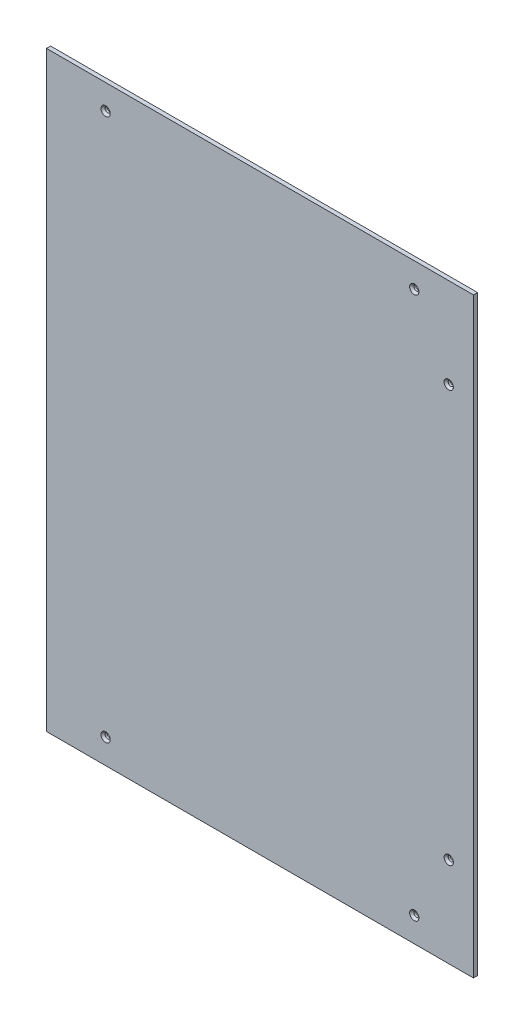
ISO-10303-21;
HEADER;
FILE_DESCRIPTION(('STEP AP214'),'2;1');
FILE_NAME('part.step','',(''),(''),'','','');
FILE_SCHEMA(('AUTOMOTIVE_DESIGN { 1 0 10303 214 1 1 1 1 }'));
ENDSEC;
DATA;
#1=APPLICATION_CONTEXT('core data for automotive mechanical design processes');
#2=APPLICATION_PROTOCOL_DEFINITION('international standard','automotive_design',2000,#1);
#3=PRODUCT_CONTEXT('',#1,'mechanical');
#4=PRODUCT('Part','Part','',(#3));
#5=PRODUCT_RELATED_PRODUCT_CATEGORY('part','',(#4));
#6=PRODUCT_DEFINITION_FORMATION('','',#4);
#7=PRODUCT_DEFINITION_CONTEXT('part definition',#1,'design');
#8=PRODUCT_DEFINITION('design','',#6,#7);
#9=PRODUCT_DEFINITION_SHAPE('','',#8);
#10=(LENGTH_UNIT() NAMED_UNIT(*) SI_UNIT(.MILLI.,.METRE.));
#11=(NAMED_UNIT(*) PLANE_ANGLE_UNIT() SI_UNIT($,.RADIAN.));
#12=(NAMED_UNIT(*) SI_UNIT($,.STERADIAN.) SOLID_ANGLE_UNIT());
#13=UNCERTAINTY_MEASURE_WITH_UNIT(LENGTH_MEASURE(1.E-05),#10,'distance_accuracy_value','');
#14=(GEOMETRIC_REPRESENTATION_CONTEXT(3) GLOBAL_UNCERTAINTY_ASSIGNED_CONTEXT((#13)) GLOBAL_UNIT_ASSIGNED_CONTEXT((#10,
#11,#12)) REPRESENTATION_CONTEXT('',''));
#15=CARTESIAN_POINT('',(0.,0.,0.));
#16=DIRECTION('',(0.,0.,1.));
#17=DIRECTION('',(1.,0.,0.));
#18=AXIS2_PLACEMENT_3D('',#15,#16,#17);
#19=CARTESIAN_POINT('',(207.5,-287.5,2.));
#20=DIRECTION('',(-1.,0.,0.));
#21=DIRECTION('',(0.,0.,1.));
#22=AXIS2_PLACEMENT_3D('',#19,#20,#21);
#23=PLANE('',#22);
#24=DIRECTION('',(0.,1.,0.));
#25=VECTOR('',#24,1.);
#26=CARTESIAN_POINT('',(207.5,-287.5,-2.));
#27=LINE('',#26,#25);
#28=CARTESIAN_POINT('',(207.5,-287.5,-2.));
#29=VERTEX_POINT('',#28);
#30=CARTESIAN_POINT('',(207.5,287.5,-2.));
#31=VERTEX_POINT('',#30);
#32=EDGE_CURVE('E126',#29,#31,#27,.T.);
#33=ORIENTED_EDGE('',*,*,#32,.T.);
#34=DIRECTION('',(0.,0.,-1.));
#35=VECTOR('',#34,1.);
#36=CARTESIAN_POINT('',(207.5,287.5,2.));
#37=LINE('',#36,#35);
#38=CARTESIAN_POINT('',(207.5,287.5,2.));
#39=VERTEX_POINT('',#38);
#40=EDGE_CURVE('E114',#39,#31,#37,.T.);
#41=ORIENTED_EDGE('',*,*,#40,.F.);
#42=DIRECTION('',(0.,1.,0.));
#43=VECTOR('',#42,1.);
#44=CARTESIAN_POINT('',(207.5,-287.5,2.));
#45=LINE('',#44,#43);
#46=CARTESIAN_POINT('',(207.5,-287.5,2.));
#47=VERTEX_POINT('',#46);
#48=EDGE_CURVE('E106',#47,#39,#45,.T.);
#49=ORIENTED_EDGE('',*,*,#48,.F.);
#50=DIRECTION('',(0.,0.,-1.));
#51=VECTOR('',#50,1.);
#52=CARTESIAN_POINT('',(207.5,-287.5,2.));
#53=LINE('',#52,#51);
#54=EDGE_CURVE('E122',#47,#29,#53,.T.);
#55=ORIENTED_EDGE('',*,*,#54,.T.);
#56=EDGE_LOOP('',(#33,#41,#49,#55));
#57=FACE_BOUND('',#56,.T.);
#58=ADVANCED_FACE('F51',(#57),#23,.F.);
#59=CARTESIAN_POINT('',(-207.5,287.5,2.));
#60=DIRECTION('',(0.,-1.,0.));
#61=DIRECTION('',(0.,0.,-1.));
#62=AXIS2_PLACEMENT_3D('',#59,#60,#61);
#63=PLANE('',#62);
#64=DIRECTION('',(-1.,0.,0.));
#65=VECTOR('',#64,1.);
#66=CARTESIAN_POINT('',(-207.5,287.5,-2.));
#67=LINE('',#66,#65);
#68=CARTESIAN_POINT('',(-207.5,287.5,-2.));
#69=VERTEX_POINT('',#68);
#70=EDGE_CURVE('E112',#31,#69,#67,.T.);
#71=ORIENTED_EDGE('',*,*,#70,.T.);
#72=DIRECTION('',(0.,0.,-1.));
#73=VECTOR('',#72,1.);
#74=CARTESIAN_POINT('',(-207.5,287.5,2.));
#75=LINE('',#74,#73);
#76=CARTESIAN_POINT('',(-207.5,287.5,2.));
#77=VERTEX_POINT('',#76);
#78=EDGE_CURVE('E110',#77,#69,#75,.T.);
#79=ORIENTED_EDGE('',*,*,#78,.F.);
#80=DIRECTION('',(-1.,0.,0.));
#81=VECTOR('',#80,1.);
#82=CARTESIAN_POINT('',(-207.5,287.5,2.));
#83=LINE('',#82,#81);
#84=EDGE_CURVE('E101',#39,#77,#83,.T.);
#85=ORIENTED_EDGE('',*,*,#84,.F.);
#86=ORIENTED_EDGE('',*,*,#40,.T.);
#87=EDGE_LOOP('',(#71,#79,#85,#86));
#88=FACE_BOUND('',#87,.T.);
#89=ADVANCED_FACE('F111',(#88),#63,.F.);
#90=CARTESIAN_POINT('',(-207.5,-287.5,2.));
#91=DIRECTION('',(1.,0.,0.));
#92=DIRECTION('',(0.,0.,-1.));
#93=AXIS2_PLACEMENT_3D('',#90,#91,#92);
#94=PLANE('',#93);
#95=DIRECTION('',(0.,-1.,0.));
#96=VECTOR('',#95,1.);
#97=CARTESIAN_POINT('',(-207.5,-287.5,-2.));
#98=LINE('',#97,#96);
#99=CARTESIAN_POINT('',(-207.5,-287.5,-2.));
#100=VERTEX_POINT('',#99);
#101=EDGE_CURVE('E87',#69,#100,#98,.T.);
#102=ORIENTED_EDGE('',*,*,#101,.T.);
#103=DIRECTION('',(0.,0.,-1.));
#104=VECTOR('',#103,1.);
#105=CARTESIAN_POINT('',(-207.5,-287.5,2.));
#106=LINE('',#105,#104);
#107=CARTESIAN_POINT('',(-207.5,-287.5,2.));
#108=VERTEX_POINT('',#107);
#109=EDGE_CURVE('E115',#108,#100,#106,.T.);
#110=ORIENTED_EDGE('',*,*,#109,.F.);
#111=DIRECTION('',(0.,-1.,0.));
#112=VECTOR('',#111,1.);
#113=CARTESIAN_POINT('',(-207.5,-287.5,2.));
#114=LINE('',#113,#112);
#115=EDGE_CURVE('E104',#77,#108,#114,.T.);
#116=ORIENTED_EDGE('',*,*,#115,.F.);
#117=ORIENTED_EDGE('',*,*,#78,.T.);
#118=EDGE_LOOP('',(#102,#110,#116,#117));
#119=FACE_BOUND('',#118,.T.);
#120=ADVANCED_FACE('F117',(#119),#94,.F.);
#121=CARTESIAN_POINT('',(-207.5,-287.5,2.));
#122=DIRECTION('',(0.,1.,0.));
#123=DIRECTION('',(0.,0.,1.));
#124=AXIS2_PLACEMENT_3D('',#121,#122,#123);
#125=PLANE('',#124);
#126=DIRECTION('',(1.,0.,0.));
#127=VECTOR('',#126,1.);
#128=CARTESIAN_POINT('',(-207.5,-287.5,-2.));
#129=LINE('',#128,#127);
#130=EDGE_CURVE('E93',#100,#29,#129,.T.);
#131=ORIENTED_EDGE('',*,*,#130,.T.);
#132=ORIENTED_EDGE('',*,*,#54,.F.);
#133=DIRECTION('',(1.,0.,0.));
#134=VECTOR('',#133,1.);
#135=CARTESIAN_POINT('',(-207.5,-287.5,2.));
#136=LINE('',#135,#134);
#137=EDGE_CURVE('E70',#108,#47,#136,.T.);
#138=ORIENTED_EDGE('',*,*,#137,.F.);
#139=ORIENTED_EDGE('',*,*,#109,.T.);
#140=EDGE_LOOP('',(#131,#132,#138,#139));
#141=FACE_BOUND('',#140,.T.);
#142=ADVANCED_FACE('F320',(#141),#125,.F.);
#143=CARTESIAN_POINT('',(0.,0.,2.));
#144=DIRECTION('',(0.,0.,-1.));
#145=DIRECTION('',(-1.,0.,0.));
#146=AXIS2_PLACEMENT_3D('',#143,#144,#145);
#147=PLANE('',#146);
#148=CARTESIAN_POINT('',(150.,263.5,2.));
#149=DIRECTION('',(0.,0.,-1.));
#150=DIRECTION('',(-1.,0.,0.));
#151=AXIS2_PLACEMENT_3D('',#148,#149,#150);
#152=CIRCLE('',#151,4.49999999999995);
#153=CARTESIAN_POINT('',(145.5,263.5,2.));
#154=VERTEX_POINT('',#153);
#155=EDGE_CURVE('E167',#154,#154,#152,.T.);
#156=ORIENTED_EDGE('',*,*,#155,.T.);
#157=EDGE_LOOP('',(#156));
#158=FACE_BOUND('',#157,.T.);
#159=CARTESIAN_POINT('',(-150.,263.5,2.));
#160=DIRECTION('',(0.,0.,-1.));
#161=DIRECTION('',(-1.,0.,0.));
#162=AXIS2_PLACEMENT_3D('',#159,#160,#161);
#163=CIRCLE('',#162,4.49999999999995);
#164=CARTESIAN_POINT('',(-154.5,263.5,2.));
#165=VERTEX_POINT('',#164);
#166=EDGE_CURVE('E163',#165,#165,#163,.T.);
#167=ORIENTED_EDGE('',*,*,#166,.T.);
#168=EDGE_LOOP('',(#167));
#169=FACE_BOUND('',#168,.T.);
#170=CARTESIAN_POINT('',(183.5,200.,2.));
#171=DIRECTION('',(0.,0.,-1.));
#172=DIRECTION('',(-1.,0.,0.));
#173=AXIS2_PLACEMENT_3D('',#170,#171,#172);
#174=CIRCLE('',#173,4.49999999999995);
#175=CARTESIAN_POINT('',(179.,200.,2.));
#176=VERTEX_POINT('',#175);
#177=EDGE_CURVE('E159',#176,#176,#174,.T.);
#178=ORIENTED_EDGE('',*,*,#177,.T.);
#179=EDGE_LOOP('',(#178));
#180=FACE_BOUND('',#179,.T.);
#181=CARTESIAN_POINT('',(183.5,-200.,2.));
#182=DIRECTION('',(0.,0.,-1.));
#183=DIRECTION('',(-1.,0.,0.));
#184=AXIS2_PLACEMENT_3D('',#181,#182,#183);
#185=CIRCLE('',#184,4.49999999999995);
#186=CARTESIAN_POINT('',(179.,-200.,2.));
#187=VERTEX_POINT('',#186);
#188=EDGE_CURVE('E155',#187,#187,#185,.T.);
#189=ORIENTED_EDGE('',*,*,#188,.T.);
#190=EDGE_LOOP('',(#189));
#191=FACE_BOUND('',#190,.T.);
#192=CARTESIAN_POINT('',(150.,-263.5,2.));
#193=DIRECTION('',(0.,0.,-1.));
#194=DIRECTION('',(-1.,0.,0.));
#195=AXIS2_PLACEMENT_3D('',#192,#193,#194);
#196=CIRCLE('',#195,4.49999999999995);
#197=CARTESIAN_POINT('',(145.5,-263.5,2.));
#198=VERTEX_POINT('',#197);
#199=EDGE_CURVE('E151',#198,#198,#196,.T.);
#200=ORIENTED_EDGE('',*,*,#199,.T.);
#201=EDGE_LOOP('',(#200));
#202=FACE_BOUND('',#201,.T.);
#203=CARTESIAN_POINT('',(-150.,-263.5,2.));
#204=DIRECTION('',(0.,0.,-1.));
#205=DIRECTION('',(-1.,0.,0.));
#206=AXIS2_PLACEMENT_3D('',#203,#204,#205);
#207=CIRCLE('',#206,4.49999999999995);
#208=CARTESIAN_POINT('',(-154.5,-263.5,2.));
#209=VERTEX_POINT('',#208);
#210=EDGE_CURVE('E147',#209,#209,#207,.T.);
#211=ORIENTED_EDGE('',*,*,#210,.T.);
#212=EDGE_LOOP('',(#211));
#213=FACE_BOUND('',#212,.T.);
#214=ORIENTED_EDGE('',*,*,#48,.T.);
#215=ORIENTED_EDGE('',*,*,#84,.T.);
#216=ORIENTED_EDGE('',*,*,#115,.T.);
#217=ORIENTED_EDGE('',*,*,#137,.T.);
#218=EDGE_LOOP('',(#214,#215,#216,#217));
#219=FACE_BOUND('',#218,.T.);
#220=ADVANCED_FACE('F102',(#158,#169,#180,#191,#202,#213,#219),#147,.F.);
#221=CARTESIAN_POINT('',(0.,0.,-2.));
#222=DIRECTION('',(0.,0.,-1.));
#223=DIRECTION('',(-1.,0.,0.));
#224=AXIS2_PLACEMENT_3D('',#221,#222,#223);
#225=PLANE('',#224);
#226=CARTESIAN_POINT('',(150.,-263.5,-2.));
#227=DIRECTION('',(0.,0.,1.));
#228=DIRECTION('',(1.,0.,0.));
#229=AXIS2_PLACEMENT_3D('',#226,#227,#228);
#230=CIRCLE('',#229,2.5);
#231=CARTESIAN_POINT('',(152.5,-263.5,-2.));
#232=VERTEX_POINT('',#231);
#233=EDGE_CURVE('E266',#232,#232,#230,.T.);
#234=ORIENTED_EDGE('',*,*,#233,.T.);
#235=EDGE_LOOP('',(#234));
#236=FACE_BOUND('',#235,.T.);
#237=CARTESIAN_POINT('',(183.5,-200.,-2.));
#238=DIRECTION('',(0.,0.,1.));
#239=DIRECTION('',(1.,0.,0.));
#240=AXIS2_PLACEMENT_3D('',#237,#238,#239);
#241=CIRCLE('',#240,2.5);
#242=CARTESIAN_POINT('',(186.,-200.,-2.));
#243=VERTEX_POINT('',#242);
#244=EDGE_CURVE('E259',#243,#243,#241,.T.);
#245=ORIENTED_EDGE('',*,*,#244,.T.);
#246=EDGE_LOOP('',(#245));
#247=FACE_BOUND('',#246,.T.);
#248=CARTESIAN_POINT('',(183.5,200.,-2.));
#249=DIRECTION('',(0.,0.,1.));
#250=DIRECTION('',(1.,0.,0.));
#251=AXIS2_PLACEMENT_3D('',#248,#249,#250);
#252=CIRCLE('',#251,2.5);
#253=CARTESIAN_POINT('',(186.,200.,-2.));
#254=VERTEX_POINT('',#253);
#255=EDGE_CURVE('E256',#254,#254,#252,.T.);
#256=ORIENTED_EDGE('',*,*,#255,.T.);
#257=EDGE_LOOP('',(#256));
#258=FACE_BOUND('',#257,.T.);
#259=CARTESIAN_POINT('',(-150.,263.5,-2.));
#260=DIRECTION('',(0.,0.,1.));
#261=DIRECTION('',(1.,0.,0.));
#262=AXIS2_PLACEMENT_3D('',#259,#260,#261);
#263=CIRCLE('',#262,2.5);
#264=CARTESIAN_POINT('',(-147.5,263.5,-2.));
#265=VERTEX_POINT('',#264);
#266=EDGE_CURVE('E260',#265,#265,#263,.T.);
#267=ORIENTED_EDGE('',*,*,#266,.T.);
#268=EDGE_LOOP('',(#267));
#269=FACE_BOUND('',#268,.T.);
#270=CARTESIAN_POINT('',(150.,263.5,-2.));
#271=DIRECTION('',(0.,0.,1.));
#272=DIRECTION('',(1.,0.,0.));
#273=AXIS2_PLACEMENT_3D('',#270,#271,#272);
#274=CIRCLE('',#273,2.5);
#275=CARTESIAN_POINT('',(152.5,263.5,-2.));
#276=VERTEX_POINT('',#275);
#277=EDGE_CURVE('E269',#276,#276,#274,.T.);
#278=ORIENTED_EDGE('',*,*,#277,.T.);
#279=EDGE_LOOP('',(#278));
#280=FACE_BOUND('',#279,.T.);
#281=CARTESIAN_POINT('',(-150.,-263.5,-2.));
#282=DIRECTION('',(0.,0.,1.));
#283=DIRECTION('',(1.,0.,0.));
#284=AXIS2_PLACEMENT_3D('',#281,#282,#283);
#285=CIRCLE('',#284,2.5);
#286=CARTESIAN_POINT('',(-147.5,-263.5,-2.));
#287=VERTEX_POINT('',#286);
#288=EDGE_CURVE('E130',#287,#287,#285,.T.);
#289=ORIENTED_EDGE('',*,*,#288,.T.);
#290=EDGE_LOOP('',(#289));
#291=FACE_BOUND('',#290,.T.);
#292=ORIENTED_EDGE('',*,*,#32,.F.);
#293=ORIENTED_EDGE('',*,*,#130,.F.);
#294=ORIENTED_EDGE('',*,*,#101,.F.);
#295=ORIENTED_EDGE('',*,*,#70,.F.);
#296=EDGE_LOOP('',(#292,#293,#294,#295));
#297=FACE_BOUND('',#296,.T.);
#298=ADVANCED_FACE('F295',(#236,#247,#258,#269,#280,#291,#297),#225,.T.);
#299=CARTESIAN_POINT('',(-150.,-263.5,-2.));
#300=DIRECTION('',(0.,0.,1.));
#301=DIRECTION('',(1.,0.,0.));
#302=AXIS2_PLACEMENT_3D('',#299,#300,#301);
#303=CYLINDRICAL_SURFACE('',#302,2.5);
#304=CARTESIAN_POINT('',(-150.,-263.5,0.));
#305=DIRECTION('',(0.,0.,-1.));
#306=DIRECTION('',(-1.,0.,0.));
#307=AXIS2_PLACEMENT_3D('',#304,#305,#306);
#308=CIRCLE('',#307,2.5);
#309=CARTESIAN_POINT('',(-152.5,-263.5,0.));
#310=VERTEX_POINT('',#309);
#311=EDGE_CURVE('E11',#310,#310,#308,.F.);
#312=ORIENTED_EDGE('',*,*,#311,.T.);
#313=EDGE_LOOP('',(#312));
#314=FACE_BOUND('',#313,.T.);
#315=ORIENTED_EDGE('',*,*,#288,.F.);
#316=EDGE_LOOP('',(#315));
#317=FACE_BOUND('',#316,.T.);
#318=ADVANCED_FACE('F300',(#314,#317),#303,.F.);
#319=CARTESIAN_POINT('',(150.,263.5,-2.));
#320=DIRECTION('',(0.,0.,1.));
#321=DIRECTION('',(1.,0.,0.));
#322=AXIS2_PLACEMENT_3D('',#319,#320,#321);
#323=CYLINDRICAL_SURFACE('',#322,2.5);
#324=CARTESIAN_POINT('',(150.,263.5,0.));
#325=DIRECTION('',(0.,0.,-1.));
#326=DIRECTION('',(-1.,0.,0.));
#327=AXIS2_PLACEMENT_3D('',#324,#325,#326);
#328=CIRCLE('',#327,2.5);
#329=CARTESIAN_POINT('',(147.5,263.5,0.));
#330=VERTEX_POINT('',#329);
#331=EDGE_CURVE('E143',#330,#330,#328,.F.);
#332=ORIENTED_EDGE('',*,*,#331,.T.);
#333=EDGE_LOOP('',(#332));
#334=FACE_BOUND('',#333,.T.);
#335=ORIENTED_EDGE('',*,*,#277,.F.);
#336=EDGE_LOOP('',(#335));
#337=FACE_BOUND('',#336,.T.);
#338=ADVANCED_FACE('F298',(#334,#337),#323,.F.);
#339=CARTESIAN_POINT('',(-150.,263.5,-2.));
#340=DIRECTION('',(0.,0.,1.));
#341=DIRECTION('',(1.,0.,0.));
#342=AXIS2_PLACEMENT_3D('',#339,#340,#341);
#343=CYLINDRICAL_SURFACE('',#342,2.5);
#344=CARTESIAN_POINT('',(-150.,263.5,0.));
#345=DIRECTION('',(0.,0.,-1.));
#346=DIRECTION('',(-1.,0.,0.));
#347=AXIS2_PLACEMENT_3D('',#344,#345,#346);
#348=CIRCLE('',#347,2.5);
#349=CARTESIAN_POINT('',(-152.5,263.5,0.));
#350=VERTEX_POINT('',#349);
#351=EDGE_CURVE('E171',#350,#350,#348,.F.);
#352=ORIENTED_EDGE('',*,*,#351,.T.);
#353=EDGE_LOOP('',(#352));
#354=FACE_BOUND('',#353,.T.);
#355=ORIENTED_EDGE('',*,*,#266,.F.);
#356=EDGE_LOOP('',(#355));
#357=FACE_BOUND('',#356,.T.);
#358=ADVANCED_FACE('F252',(#354,#357),#343,.F.);
#359=CARTESIAN_POINT('',(183.5,200.,-2.));
#360=DIRECTION('',(0.,0.,1.));
#361=DIRECTION('',(1.,0.,0.));
#362=AXIS2_PLACEMENT_3D('',#359,#360,#361);
#363=CYLINDRICAL_SURFACE('',#362,2.5);
#364=CARTESIAN_POINT('',(183.5,200.,0.));
#365=DIRECTION('',(0.,0.,-1.));
#366=DIRECTION('',(-1.,0.,0.));
#367=AXIS2_PLACEMENT_3D('',#364,#365,#366);
#368=CIRCLE('',#367,2.5);
#369=CARTESIAN_POINT('',(181.,200.,0.));
#370=VERTEX_POINT('',#369);
#371=EDGE_CURVE('E175',#370,#370,#368,.F.);
#372=ORIENTED_EDGE('',*,*,#371,.T.);
#373=EDGE_LOOP('',(#372));
#374=FACE_BOUND('',#373,.T.);
#375=ORIENTED_EDGE('',*,*,#255,.F.);
#376=EDGE_LOOP('',(#375));
#377=FACE_BOUND('',#376,.T.);
#378=ADVANCED_FACE('F248',(#374,#377),#363,.F.);
#379=CARTESIAN_POINT('',(183.5,-200.,-2.));
#380=DIRECTION('',(0.,0.,1.));
#381=DIRECTION('',(1.,0.,0.));
#382=AXIS2_PLACEMENT_3D('',#379,#380,#381);
#383=CYLINDRICAL_SURFACE('',#382,2.5);
#384=CARTESIAN_POINT('',(183.5,-200.,0.));
#385=DIRECTION('',(0.,0.,-1.));
#386=DIRECTION('',(-1.,0.,0.));
#387=AXIS2_PLACEMENT_3D('',#384,#385,#386);
#388=CIRCLE('',#387,2.5);
#389=CARTESIAN_POINT('',(181.,-200.,0.));
#390=VERTEX_POINT('',#389);
#391=EDGE_CURVE('E179',#390,#390,#388,.F.);
#392=ORIENTED_EDGE('',*,*,#391,.T.);
#393=EDGE_LOOP('',(#392));
#394=FACE_BOUND('',#393,.T.);
#395=ORIENTED_EDGE('',*,*,#244,.F.);
#396=EDGE_LOOP('',(#395));
#397=FACE_BOUND('',#396,.T.);
#398=ADVANCED_FACE('F251',(#394,#397),#383,.F.);
#399=CARTESIAN_POINT('',(150.,-263.5,-2.));
#400=DIRECTION('',(0.,0.,1.));
#401=DIRECTION('',(1.,0.,0.));
#402=AXIS2_PLACEMENT_3D('',#399,#400,#401);
#403=CYLINDRICAL_SURFACE('',#402,2.5);
#404=CARTESIAN_POINT('',(150.,-263.5,0.));
#405=DIRECTION('',(0.,0.,-1.));
#406=DIRECTION('',(-1.,0.,0.));
#407=AXIS2_PLACEMENT_3D('',#404,#405,#406);
#408=CIRCLE('',#407,2.5);
#409=CARTESIAN_POINT('',(147.5,-263.5,0.));
#410=VERTEX_POINT('',#409);
#411=EDGE_CURVE('E62',#410,#410,#408,.F.);
#412=ORIENTED_EDGE('',*,*,#411,.T.);
#413=EDGE_LOOP('',(#412));
#414=FACE_BOUND('',#413,.T.);
#415=ORIENTED_EDGE('',*,*,#233,.F.);
#416=EDGE_LOOP('',(#415));
#417=FACE_BOUND('',#416,.T.);
#418=ADVANCED_FACE('F187',(#414,#417),#403,.F.);
#419=CARTESIAN_POINT('',(150.,263.5,0.));
#420=DIRECTION('',(0.,0.,1.));
#421=DIRECTION('',(1.,0.,0.));
#422=AXIS2_PLACEMENT_3D('',#419,#420,#421);
#423=CONICAL_SURFACE('',#422,2.5,0.785398163397446);
#424=ORIENTED_EDGE('',*,*,#155,.F.);
#425=EDGE_LOOP('',(#424));
#426=FACE_BOUND('',#425,.T.);
#427=ORIENTED_EDGE('',*,*,#331,.F.);
#428=EDGE_LOOP('',(#427));
#429=FACE_BOUND('',#428,.T.);
#430=ADVANCED_FACE('F216',(#426,#429),#423,.F.);
#431=CARTESIAN_POINT('',(-150.,263.5,0.));
#432=DIRECTION('',(0.,0.,1.));
#433=DIRECTION('',(1.,0.,0.));
#434=AXIS2_PLACEMENT_3D('',#431,#432,#433);
#435=CONICAL_SURFACE('',#434,2.5,0.785398163397446);
#436=ORIENTED_EDGE('',*,*,#166,.F.);
#437=EDGE_LOOP('',(#436));
#438=FACE_BOUND('',#437,.T.);
#439=ORIENTED_EDGE('',*,*,#351,.F.);
#440=EDGE_LOOP('',(#439));
#441=FACE_BOUND('',#440,.T.);
#442=ADVANCED_FACE('F222',(#438,#441),#435,.F.);
#443=CARTESIAN_POINT('',(183.5,200.,0.));
#444=DIRECTION('',(0.,0.,1.));
#445=DIRECTION('',(1.,0.,0.));
#446=AXIS2_PLACEMENT_3D('',#443,#444,#445);
#447=CONICAL_SURFACE('',#446,2.5,0.785398163397446);
#448=ORIENTED_EDGE('',*,*,#177,.F.);
#449=EDGE_LOOP('',(#448));
#450=FACE_BOUND('',#449,.T.);
#451=ORIENTED_EDGE('',*,*,#371,.F.);
#452=EDGE_LOOP('',(#451));
#453=FACE_BOUND('',#452,.T.);
#454=ADVANCED_FACE('F200',(#450,#453),#447,.F.);
#455=CARTESIAN_POINT('',(183.5,-200.,0.));
#456=DIRECTION('',(0.,0.,1.));
#457=DIRECTION('',(1.,0.,0.));
#458=AXIS2_PLACEMENT_3D('',#455,#456,#457);
#459=CONICAL_SURFACE('',#458,2.5,0.785398163397446);
#460=ORIENTED_EDGE('',*,*,#188,.F.);
#461=EDGE_LOOP('',(#460));
#462=FACE_BOUND('',#461,.T.);
#463=ORIENTED_EDGE('',*,*,#391,.F.);
#464=EDGE_LOOP('',(#463));
#465=FACE_BOUND('',#464,.T.);
#466=ADVANCED_FACE('F192',(#462,#465),#459,.F.);
#467=CARTESIAN_POINT('',(150.,-263.5,0.));
#468=DIRECTION('',(0.,0.,1.));
#469=DIRECTION('',(1.,0.,0.));
#470=AXIS2_PLACEMENT_3D('',#467,#468,#469);
#471=CONICAL_SURFACE('',#470,2.5,0.785398163397446);
#472=ORIENTED_EDGE('',*,*,#199,.F.);
#473=EDGE_LOOP('',(#472));
#474=FACE_BOUND('',#473,.T.);
#475=ORIENTED_EDGE('',*,*,#411,.F.);
#476=EDGE_LOOP('',(#475));
#477=FACE_BOUND('',#476,.T.);
#478=ADVANCED_FACE('F190',(#474,#477),#471,.F.);
#479=CARTESIAN_POINT('',(-150.,-263.5,0.));
#480=DIRECTION('',(0.,0.,1.));
#481=DIRECTION('',(1.,0.,0.));
#482=AXIS2_PLACEMENT_3D('',#479,#480,#481);
#483=CONICAL_SURFACE('',#482,2.5,0.785398163397446);
#484=ORIENTED_EDGE('',*,*,#210,.F.);
#485=EDGE_LOOP('',(#484));
#486=FACE_BOUND('',#485,.T.);
#487=ORIENTED_EDGE('',*,*,#311,.F.);
#488=EDGE_LOOP('',(#487));
#489=FACE_BOUND('',#488,.T.);
#490=ADVANCED_FACE('F54',(#486,#489),#483,.F.);
#491=CLOSED_SHELL('',(#58,#89,#120,#142,#220,#298,#318,#338,#358,#378,#398,#418,#430,#442,#454,
#466,#478,#490));
#492=MANIFOLD_SOLID_BREP('B2',#491);
#493=ADVANCED_BREP_SHAPE_REPRESENTATION('',(#18,#492),#14);
#494=SHAPE_DEFINITION_REPRESENTATION(#9,#493);
ENDSEC;
END-ISO-10303-21;
